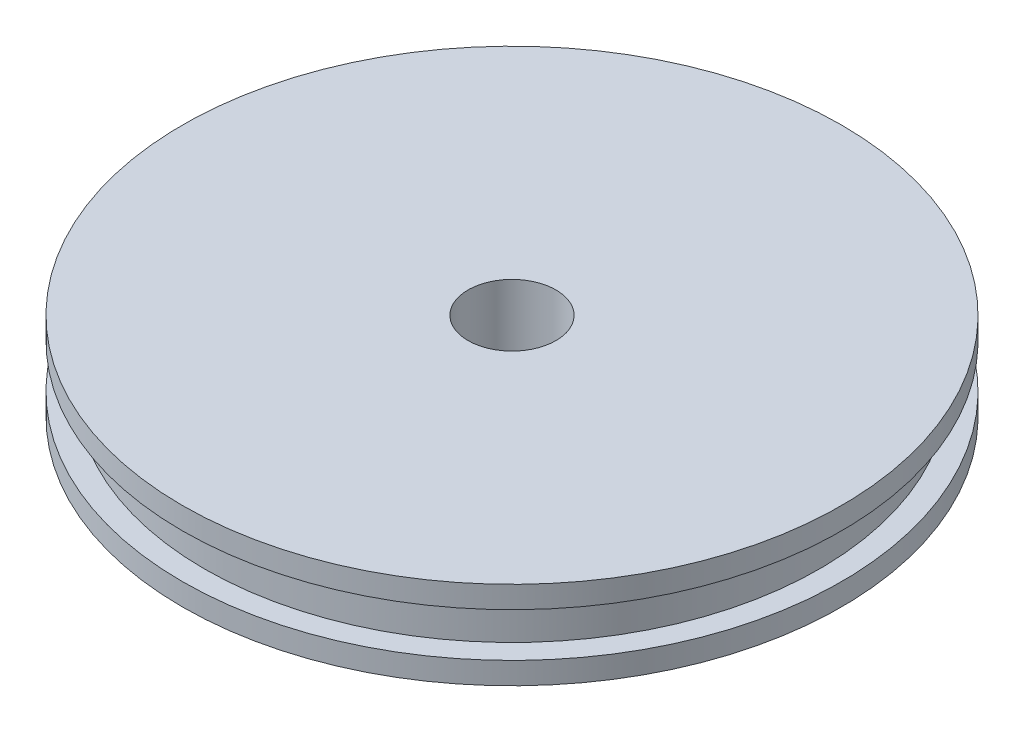
ISO-10303-21;
HEADER;
FILE_DESCRIPTION(('STEP AP214'),'2;1');
FILE_NAME('part.step','',(''),(''),'','','');
FILE_SCHEMA(('AUTOMOTIVE_DESIGN { 1 0 10303 214 1 1 1 1 }'));
ENDSEC;
DATA;
#1=APPLICATION_CONTEXT('core data for automotive mechanical design processes');
#2=APPLICATION_PROTOCOL_DEFINITION('international standard','automotive_design',2000,#1);
#3=PRODUCT_CONTEXT('',#1,'mechanical');
#4=PRODUCT('Part','Part','',(#3));
#5=PRODUCT_RELATED_PRODUCT_CATEGORY('part','',(#4));
#6=PRODUCT_DEFINITION_FORMATION('','',#4);
#7=PRODUCT_DEFINITION_CONTEXT('part definition',#1,'design');
#8=PRODUCT_DEFINITION('design','',#6,#7);
#9=PRODUCT_DEFINITION_SHAPE('','',#8);
#10=(LENGTH_UNIT() NAMED_UNIT(*) SI_UNIT(.MILLI.,.METRE.));
#11=(NAMED_UNIT(*) PLANE_ANGLE_UNIT() SI_UNIT($,.RADIAN.));
#12=(NAMED_UNIT(*) SI_UNIT($,.STERADIAN.) SOLID_ANGLE_UNIT());
#13=UNCERTAINTY_MEASURE_WITH_UNIT(LENGTH_MEASURE(1.E-05),#10,'distance_accuracy_value','');
#14=(GEOMETRIC_REPRESENTATION_CONTEXT(3) GLOBAL_UNCERTAINTY_ASSIGNED_CONTEXT((#13)) GLOBAL_UNIT_ASSIGNED_CONTEXT((#10,
#11,#12)) REPRESENTATION_CONTEXT('',''));
#15=CARTESIAN_POINT('',(0.,0.,0.));
#16=DIRECTION('',(0.,0.,1.));
#17=DIRECTION('',(1.,0.,0.));
#18=AXIS2_PLACEMENT_3D('',#15,#16,#17);
#19=CARTESIAN_POINT('',(0.,2.5,0.));
#20=DIRECTION('',(0.,-1.,0.));
#21=DIRECTION('',(0.,0.,-1.));
#22=AXIS2_PLACEMENT_3D('',#19,#20,#21);
#23=CYLINDRICAL_SURFACE('',#22,35.);
#24=CARTESIAN_POINT('',(0.,-2.5,0.));
#25=DIRECTION('',(0.,1.,0.));
#26=DIRECTION('',(0.,0.,1.));
#27=AXIS2_PLACEMENT_3D('',#24,#25,#26);
#28=CIRCLE('',#27,35.);
#29=CARTESIAN_POINT('',(0.,-2.5,35.));
#30=VERTEX_POINT('',#29);
#31=EDGE_CURVE('E85',#30,#30,#28,.T.);
#32=ORIENTED_EDGE('',*,*,#31,.T.);
#33=EDGE_LOOP('',(#32));
#34=FACE_BOUND('',#33,.T.);
#35=CARTESIAN_POINT('',(0.,2.5,0.));
#36=DIRECTION('',(0.,1.,0.));
#37=DIRECTION('',(0.,0.,1.));
#38=AXIS2_PLACEMENT_3D('',#35,#36,#37);
#39=CIRCLE('',#38,35.);
#40=CARTESIAN_POINT('',(0.,2.5,35.));
#41=VERTEX_POINT('',#40);
#42=EDGE_CURVE('E11',#41,#41,#39,.T.);
#43=ORIENTED_EDGE('',*,*,#42,.F.);
#44=EDGE_LOOP('',(#43));
#45=FACE_BOUND('',#44,.T.);
#46=ADVANCED_FACE('F65',(#34,#45),#23,.T.);
#47=CARTESIAN_POINT('',(0.,5.,0.));
#48=DIRECTION('',(0.,1.,0.));
#49=DIRECTION('',(0.,0.,1.));
#50=AXIS2_PLACEMENT_3D('',#47,#48,#49);
#51=PLANE('',#50);
#52=CARTESIAN_POINT('',(0.,5.,0.));
#53=DIRECTION('',(0.,1.,0.));
#54=DIRECTION('',(0.,0.,1.));
#55=AXIS2_PLACEMENT_3D('',#52,#53,#54);
#56=CIRCLE('',#55,37.5);
#57=CARTESIAN_POINT('',(0.,5.,37.5));
#58=VERTEX_POINT('',#57);
#59=EDGE_CURVE('E71',#58,#58,#56,.T.);
#60=ORIENTED_EDGE('',*,*,#59,.T.);
#61=EDGE_LOOP('',(#60));
#62=FACE_BOUND('',#61,.T.);
#63=CARTESIAN_POINT('',(0.,5.,0.));
#64=DIRECTION('',(0.,1.,0.));
#65=DIRECTION('',(0.,0.,1.));
#66=AXIS2_PLACEMENT_3D('',#63,#64,#65);
#67=CIRCLE('',#66,5.);
#68=CARTESIAN_POINT('',(0.,5.,5.));
#69=VERTEX_POINT('',#68);
#70=EDGE_CURVE('E90',#69,#69,#67,.T.);
#71=ORIENTED_EDGE('',*,*,#70,.F.);
#72=EDGE_LOOP('',(#71));
#73=FACE_BOUND('',#72,.T.);
#74=ADVANCED_FACE('F100',(#62,#73),#51,.T.);
#75=CARTESIAN_POINT('',(0.,2.5,0.));
#76=DIRECTION('',(0.,1.,0.));
#77=DIRECTION('',(0.,0.,1.));
#78=AXIS2_PLACEMENT_3D('',#75,#76,#77);
#79=PLANE('',#78);
#80=ORIENTED_EDGE('',*,*,#42,.T.);
#81=EDGE_LOOP('',(#80));
#82=FACE_BOUND('',#81,.T.);
#83=CARTESIAN_POINT('',(0.,2.5,0.));
#84=DIRECTION('',(0.,1.,0.));
#85=DIRECTION('',(0.,0.,1.));
#86=AXIS2_PLACEMENT_3D('',#83,#84,#85);
#87=CIRCLE('',#86,37.5);
#88=CARTESIAN_POINT('',(0.,2.5,37.5));
#89=VERTEX_POINT('',#88);
#90=EDGE_CURVE('E75',#89,#89,#87,.T.);
#91=ORIENTED_EDGE('',*,*,#90,.F.);
#92=EDGE_LOOP('',(#91));
#93=FACE_BOUND('',#92,.T.);
#94=ADVANCED_FACE('F102',(#82,#93),#79,.F.);
#95=CARTESIAN_POINT('',(0.,5.,0.));
#96=DIRECTION('',(0.,-1.,0.));
#97=DIRECTION('',(0.,0.,-1.));
#98=AXIS2_PLACEMENT_3D('',#95,#96,#97);
#99=CYLINDRICAL_SURFACE('',#98,37.5);
#100=ORIENTED_EDGE('',*,*,#59,.F.);
#101=EDGE_LOOP('',(#100));
#102=FACE_BOUND('',#101,.T.);
#103=ORIENTED_EDGE('',*,*,#90,.T.);
#104=EDGE_LOOP('',(#103));
#105=FACE_BOUND('',#104,.T.);
#106=ADVANCED_FACE('F108',(#102,#105),#99,.T.);
#107=CARTESIAN_POINT('',(0.,-5.,0.));
#108=DIRECTION('',(0.,1.,0.));
#109=DIRECTION('',(0.,0.,1.));
#110=AXIS2_PLACEMENT_3D('',#107,#108,#109);
#111=PLANE('',#110);
#112=CARTESIAN_POINT('',(0.,-5.,0.));
#113=DIRECTION('',(0.,1.,0.));
#114=DIRECTION('',(0.,0.,1.));
#115=AXIS2_PLACEMENT_3D('',#112,#113,#114);
#116=CIRCLE('',#115,37.5);
#117=CARTESIAN_POINT('',(0.,-5.,37.5));
#118=VERTEX_POINT('',#117);
#119=EDGE_CURVE('E80',#118,#118,#116,.T.);
#120=ORIENTED_EDGE('',*,*,#119,.F.);
#121=EDGE_LOOP('',(#120));
#122=FACE_BOUND('',#121,.T.);
#123=CARTESIAN_POINT('',(0.,-5.,0.));
#124=DIRECTION('',(0.,1.,0.));
#125=DIRECTION('',(0.,0.,1.));
#126=AXIS2_PLACEMENT_3D('',#123,#124,#125);
#127=CIRCLE('',#126,5.);
#128=CARTESIAN_POINT('',(0.,-5.,5.));
#129=VERTEX_POINT('',#128);
#130=EDGE_CURVE('E91',#129,#129,#127,.T.);
#131=ORIENTED_EDGE('',*,*,#130,.T.);
#132=EDGE_LOOP('',(#131));
#133=FACE_BOUND('',#132,.T.);
#134=ADVANCED_FACE('F112',(#122,#133),#111,.F.);
#135=CARTESIAN_POINT('',(0.,-5.,0.));
#136=DIRECTION('',(0.,1.,0.));
#137=DIRECTION('',(0.,0.,1.));
#138=AXIS2_PLACEMENT_3D('',#135,#136,#137);
#139=CYLINDRICAL_SURFACE('',#138,37.5);
#140=ORIENTED_EDGE('',*,*,#119,.T.);
#141=EDGE_LOOP('',(#140));
#142=FACE_BOUND('',#141,.T.);
#143=CARTESIAN_POINT('',(0.,-2.5,0.));
#144=DIRECTION('',(0.,1.,0.));
#145=DIRECTION('',(0.,0.,1.));
#146=AXIS2_PLACEMENT_3D('',#143,#144,#145);
#147=CIRCLE('',#146,37.5);
#148=CARTESIAN_POINT('',(0.,-2.5,37.5));
#149=VERTEX_POINT('',#148);
#150=EDGE_CURVE('E82',#149,#149,#147,.T.);
#151=ORIENTED_EDGE('',*,*,#150,.F.);
#152=EDGE_LOOP('',(#151));
#153=FACE_BOUND('',#152,.T.);
#154=ADVANCED_FACE('F119',(#142,#153),#139,.T.);
#155=CARTESIAN_POINT('',(0.,-2.5,0.));
#156=DIRECTION('',(0.,1.,0.));
#157=DIRECTION('',(0.,0.,1.));
#158=AXIS2_PLACEMENT_3D('',#155,#156,#157);
#159=PLANE('',#158);
#160=ORIENTED_EDGE('',*,*,#31,.F.);
#161=EDGE_LOOP('',(#160));
#162=FACE_BOUND('',#161,.T.);
#163=ORIENTED_EDGE('',*,*,#150,.T.);
#164=EDGE_LOOP('',(#163));
#165=FACE_BOUND('',#164,.T.);
#166=ADVANCED_FACE('F127',(#162,#165),#159,.T.);
#167=CARTESIAN_POINT('',(0.,5.,0.));
#168=DIRECTION('',(0.,-1.,0.));
#169=DIRECTION('',(0.,0.,-1.));
#170=AXIS2_PLACEMENT_3D('',#167,#168,#169);
#171=CYLINDRICAL_SURFACE('',#170,5.);
#172=ORIENTED_EDGE('',*,*,#70,.T.);
#173=EDGE_LOOP('',(#172));
#174=FACE_BOUND('',#173,.T.);
#175=ORIENTED_EDGE('',*,*,#130,.F.);
#176=EDGE_LOOP('',(#175));
#177=FACE_BOUND('',#176,.T.);
#178=ADVANCED_FACE('F97',(#174,#177),#171,.F.);
#179=CLOSED_SHELL('',(#46,#74,#94,#106,#134,#154,#166,#178));
#180=MANIFOLD_SOLID_BREP('B2',#179);
#181=ADVANCED_BREP_SHAPE_REPRESENTATION('',(#18,#180),#14);
#182=SHAPE_DEFINITION_REPRESENTATION(#9,#181);
ENDSEC;
END-ISO-10303-21;
